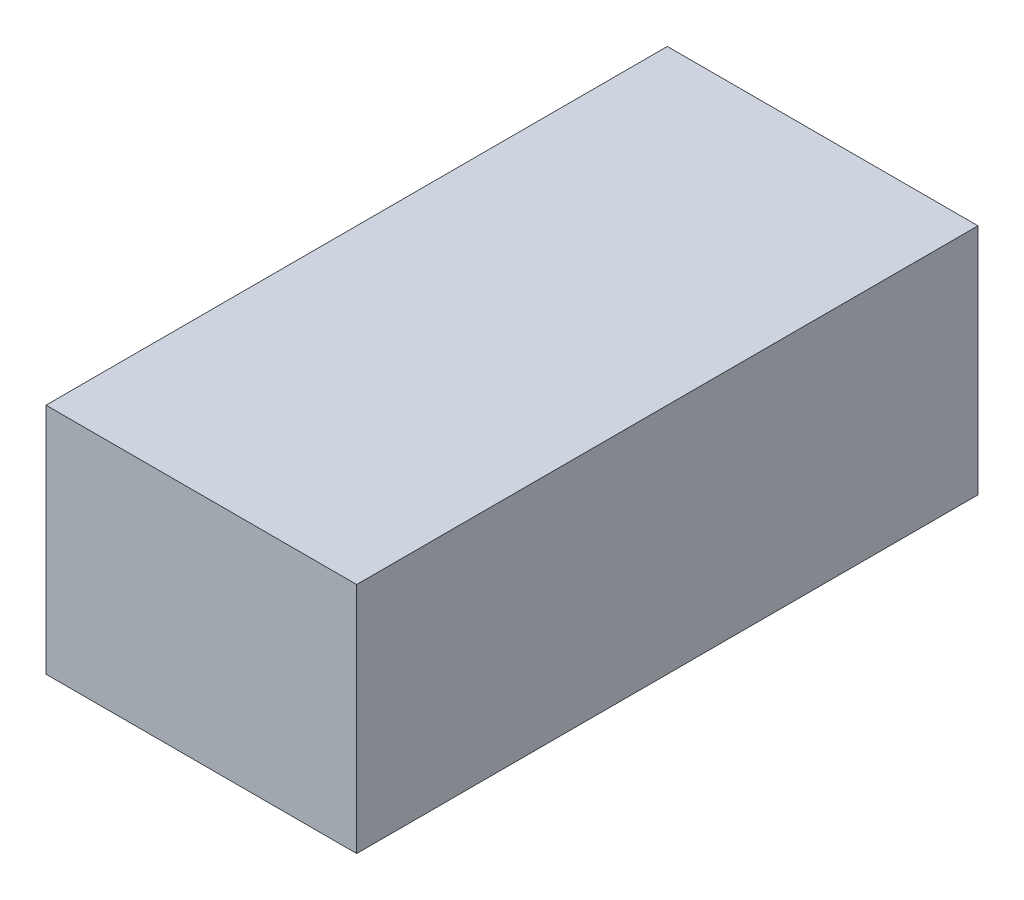
ISO-10303-21;
HEADER;
FILE_DESCRIPTION(('STEP AP214'),'2;1');
FILE_NAME('part.step','',(''),(''),'','','');
FILE_SCHEMA(('AUTOMOTIVE_DESIGN { 1 0 10303 214 1 1 1 1 }'));
ENDSEC;
DATA;
#1=APPLICATION_CONTEXT('core data for automotive mechanical design processes');
#2=APPLICATION_PROTOCOL_DEFINITION('international standard','automotive_design',2000,#1);
#3=PRODUCT_CONTEXT('',#1,'mechanical');
#4=PRODUCT('Part','Part','',(#3));
#5=PRODUCT_RELATED_PRODUCT_CATEGORY('part','',(#4));
#6=PRODUCT_DEFINITION_FORMATION('','',#4);
#7=PRODUCT_DEFINITION_CONTEXT('part definition',#1,'design');
#8=PRODUCT_DEFINITION('design','',#6,#7);
#9=PRODUCT_DEFINITION_SHAPE('','',#8);
#10=(LENGTH_UNIT() NAMED_UNIT(*) SI_UNIT(.MILLI.,.METRE.));
#11=(NAMED_UNIT(*) PLANE_ANGLE_UNIT() SI_UNIT($,.RADIAN.));
#12=(NAMED_UNIT(*) SI_UNIT($,.STERADIAN.) SOLID_ANGLE_UNIT());
#13=UNCERTAINTY_MEASURE_WITH_UNIT(LENGTH_MEASURE(1.E-05),#10,'distance_accuracy_value','');
#14=(GEOMETRIC_REPRESENTATION_CONTEXT(3) GLOBAL_UNCERTAINTY_ASSIGNED_CONTEXT((#13)) GLOBAL_UNIT_ASSIGNED_CONTEXT((#10,
#11,#12)) REPRESENTATION_CONTEXT('',''));
#15=CARTESIAN_POINT('',(0.,0.,0.));
#16=DIRECTION('',(0.,0.,1.));
#17=DIRECTION('',(1.,0.,0.));
#18=AXIS2_PLACEMENT_3D('',#15,#16,#17);
#19=CARTESIAN_POINT('',(12.7,19.05,25.4));
#20=DIRECTION('',(-1.,0.,0.));
#21=DIRECTION('',(0.,0.,1.));
#22=AXIS2_PLACEMENT_3D('',#19,#20,#21);
#23=PLANE('',#22);
#24=DIRECTION('',(0.,0.,-1.));
#25=VECTOR('',#24,1.);
#26=CARTESIAN_POINT('',(12.7,0.,25.4));
#27=LINE('',#26,#25);
#28=CARTESIAN_POINT('',(12.7,0.,25.4));
#29=VERTEX_POINT('',#28);
#30=CARTESIAN_POINT('',(12.7,0.,-25.4));
#31=VERTEX_POINT('',#30);
#32=EDGE_CURVE('E96',#29,#31,#27,.T.);
#33=ORIENTED_EDGE('',*,*,#32,.T.);
#34=DIRECTION('',(0.,-1.,0.));
#35=VECTOR('',#34,1.);
#36=CARTESIAN_POINT('',(12.7,19.05,-25.4));
#37=LINE('',#36,#35);
#38=CARTESIAN_POINT('',(12.7,19.05,-25.4));
#39=VERTEX_POINT('',#38);
#40=EDGE_CURVE('E11',#39,#31,#37,.T.);
#41=ORIENTED_EDGE('',*,*,#40,.F.);
#42=DIRECTION('',(0.,0.,-1.));
#43=VECTOR('',#42,1.);
#44=CARTESIAN_POINT('',(12.7,19.05,25.4));
#45=LINE('',#44,#43);
#46=CARTESIAN_POINT('',(12.7,19.05,25.4));
#47=VERTEX_POINT('',#46);
#48=EDGE_CURVE('E84',#47,#39,#45,.T.);
#49=ORIENTED_EDGE('',*,*,#48,.F.);
#50=DIRECTION('',(0.,-1.,0.));
#51=VECTOR('',#50,1.);
#52=CARTESIAN_POINT('',(12.7,19.05,25.4));
#53=LINE('',#52,#51);
#54=EDGE_CURVE('E92',#47,#29,#53,.T.);
#55=ORIENTED_EDGE('',*,*,#54,.T.);
#56=EDGE_LOOP('',(#33,#41,#49,#55));
#57=FACE_BOUND('',#56,.T.);
#58=ADVANCED_FACE('F33',(#57),#23,.F.);
#59=CARTESIAN_POINT('',(-12.7,19.05,-25.4));
#60=DIRECTION('',(0.,0.,1.));
#61=DIRECTION('',(1.,0.,0.));
#62=AXIS2_PLACEMENT_3D('',#59,#60,#61);
#63=PLANE('',#62);
#64=DIRECTION('',(-1.,0.,0.));
#65=VECTOR('',#64,1.);
#66=CARTESIAN_POINT('',(-12.7,0.,-25.4));
#67=LINE('',#66,#65);
#68=CARTESIAN_POINT('',(-12.7,0.,-25.4));
#69=VERTEX_POINT('',#68);
#70=EDGE_CURVE('E88',#31,#69,#67,.T.);
#71=ORIENTED_EDGE('',*,*,#70,.T.);
#72=DIRECTION('',(0.,-1.,0.));
#73=VECTOR('',#72,1.);
#74=CARTESIAN_POINT('',(-12.7,19.05,-25.4));
#75=LINE('',#74,#73);
#76=CARTESIAN_POINT('',(-12.7,19.05,-25.4));
#77=VERTEX_POINT('',#76);
#78=EDGE_CURVE('E41',#77,#69,#75,.T.);
#79=ORIENTED_EDGE('',*,*,#78,.F.);
#80=DIRECTION('',(-1.,0.,0.));
#81=VECTOR('',#80,1.);
#82=CARTESIAN_POINT('',(-12.7,19.05,-25.4));
#83=LINE('',#82,#81);
#84=EDGE_CURVE('E79',#39,#77,#83,.T.);
#85=ORIENTED_EDGE('',*,*,#84,.F.);
#86=ORIENTED_EDGE('',*,*,#40,.T.);
#87=EDGE_LOOP('',(#71,#79,#85,#86));
#88=FACE_BOUND('',#87,.T.);
#89=ADVANCED_FACE('F87',(#88),#63,.F.);
#90=CARTESIAN_POINT('',(-12.7,19.05,25.4));
#91=DIRECTION('',(1.,0.,0.));
#92=DIRECTION('',(0.,0.,-1.));
#93=AXIS2_PLACEMENT_3D('',#90,#91,#92);
#94=PLANE('',#93);
#95=DIRECTION('',(0.,0.,1.));
#96=VECTOR('',#95,1.);
#97=CARTESIAN_POINT('',(-12.7,0.,25.4));
#98=LINE('',#97,#96);
#99=CARTESIAN_POINT('',(-12.7,0.,25.4));
#100=VERTEX_POINT('',#99);
#101=EDGE_CURVE('E66',#69,#100,#98,.T.);
#102=ORIENTED_EDGE('',*,*,#101,.T.);
#103=DIRECTION('',(0.,-1.,0.));
#104=VECTOR('',#103,1.);
#105=CARTESIAN_POINT('',(-12.7,19.05,25.4));
#106=LINE('',#105,#104);
#107=CARTESIAN_POINT('',(-12.7,19.05,25.4));
#108=VERTEX_POINT('',#107);
#109=EDGE_CURVE('E89',#108,#100,#106,.T.);
#110=ORIENTED_EDGE('',*,*,#109,.F.);
#111=DIRECTION('',(0.,0.,1.));
#112=VECTOR('',#111,1.);
#113=CARTESIAN_POINT('',(-12.7,19.05,25.4));
#114=LINE('',#113,#112);
#115=EDGE_CURVE('E82',#77,#108,#114,.T.);
#116=ORIENTED_EDGE('',*,*,#115,.F.);
#117=ORIENTED_EDGE('',*,*,#78,.T.);
#118=EDGE_LOOP('',(#102,#110,#116,#117));
#119=FACE_BOUND('',#118,.T.);
#120=ADVANCED_FACE('F90',(#119),#94,.F.);
#121=CARTESIAN_POINT('',(-12.7,19.05,25.4));
#122=DIRECTION('',(0.,0.,-1.));
#123=DIRECTION('',(-1.,0.,0.));
#124=AXIS2_PLACEMENT_3D('',#121,#122,#123);
#125=PLANE('',#124);
#126=DIRECTION('',(1.,0.,0.));
#127=VECTOR('',#126,1.);
#128=CARTESIAN_POINT('',(-12.7,0.,25.4));
#129=LINE('',#128,#127);
#130=EDGE_CURVE('E72',#100,#29,#129,.T.);
#131=ORIENTED_EDGE('',*,*,#130,.T.);
#132=ORIENTED_EDGE('',*,*,#54,.F.);
#133=DIRECTION('',(1.,0.,0.));
#134=VECTOR('',#133,1.);
#135=CARTESIAN_POINT('',(-12.7,19.05,25.4));
#136=LINE('',#135,#134);
#137=EDGE_CURVE('E49',#108,#47,#136,.T.);
#138=ORIENTED_EDGE('',*,*,#137,.F.);
#139=ORIENTED_EDGE('',*,*,#109,.T.);
#140=EDGE_LOOP('',(#131,#132,#138,#139));
#141=FACE_BOUND('',#140,.T.);
#142=ADVANCED_FACE('F103',(#141),#125,.F.);
#143=CARTESIAN_POINT('',(0.,19.05,0.));
#144=DIRECTION('',(0.,-1.,0.));
#145=DIRECTION('',(0.,0.,-1.));
#146=AXIS2_PLACEMENT_3D('',#143,#144,#145);
#147=PLANE('',#146);
#148=ORIENTED_EDGE('',*,*,#48,.T.);
#149=ORIENTED_EDGE('',*,*,#84,.T.);
#150=ORIENTED_EDGE('',*,*,#115,.T.);
#151=ORIENTED_EDGE('',*,*,#137,.T.);
#152=EDGE_LOOP('',(#148,#149,#150,#151));
#153=FACE_BOUND('',#152,.T.);
#154=ADVANCED_FACE('F80',(#153),#147,.F.);
#155=CARTESIAN_POINT('',(0.,0.,0.));
#156=DIRECTION('',(0.,-1.,0.));
#157=DIRECTION('',(0.,0.,-1.));
#158=AXIS2_PLACEMENT_3D('',#155,#156,#157);
#159=PLANE('',#158);
#160=ORIENTED_EDGE('',*,*,#32,.F.);
#161=ORIENTED_EDGE('',*,*,#130,.F.);
#162=ORIENTED_EDGE('',*,*,#101,.F.);
#163=ORIENTED_EDGE('',*,*,#70,.F.);
#164=EDGE_LOOP('',(#160,#161,#162,#163));
#165=FACE_BOUND('',#164,.T.);
#166=ADVANCED_FACE('F106',(#165),#159,.T.);
#167=CLOSED_SHELL('',(#58,#89,#120,#142,#154,#166));
#168=MANIFOLD_SOLID_BREP('B2',#167);
#169=ADVANCED_BREP_SHAPE_REPRESENTATION('',(#18,#168),#14);
#170=SHAPE_DEFINITION_REPRESENTATION(#9,#169);
ENDSEC;
END-ISO-10303-21;
